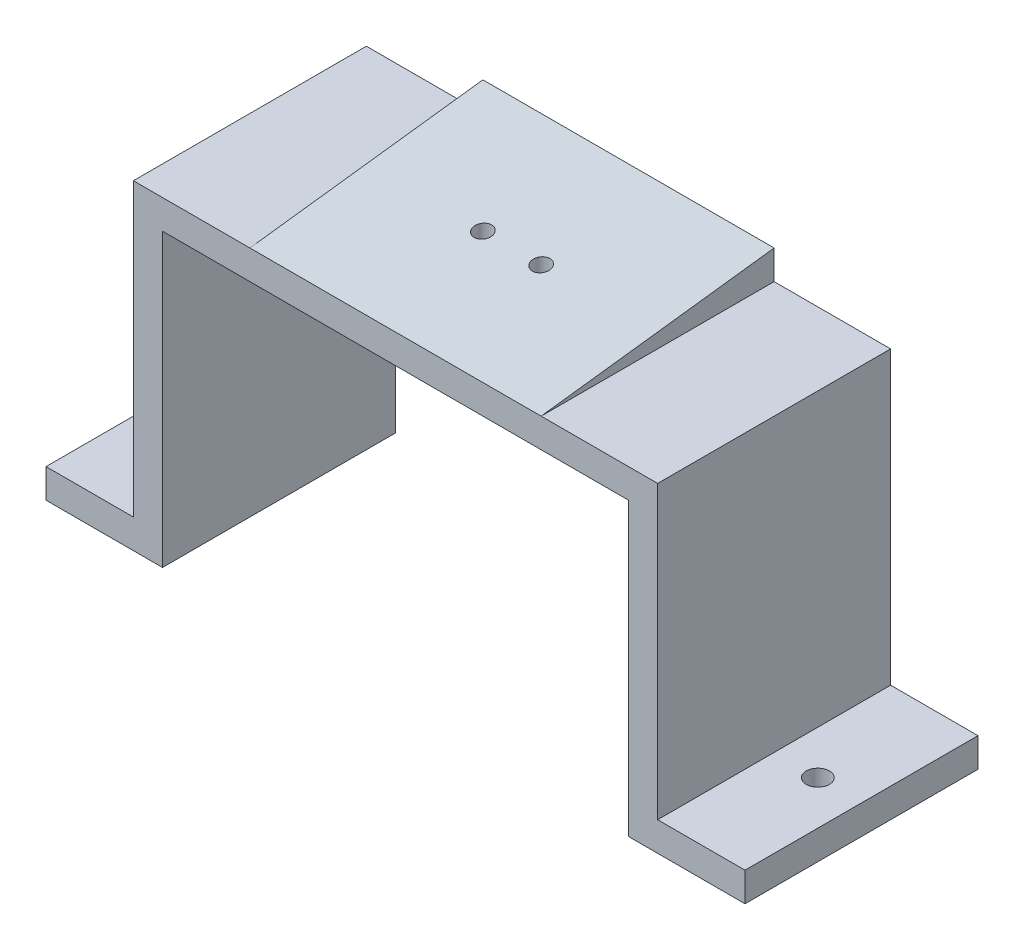
ISO-10303-21;
HEADER;
FILE_DESCRIPTION(('STEP AP214'),'2;1');
FILE_NAME('part.step','',(''),(''),'','','');
FILE_SCHEMA(('AUTOMOTIVE_DESIGN { 1 0 10303 214 1 1 1 1 }'));
ENDSEC;
DATA;
#1=APPLICATION_CONTEXT('core data for automotive mechanical design processes');
#2=APPLICATION_PROTOCOL_DEFINITION('international standard','automotive_design',2000,#1);
#3=PRODUCT_CONTEXT('',#1,'mechanical');
#4=PRODUCT('Part','Part','',(#3));
#5=PRODUCT_RELATED_PRODUCT_CATEGORY('part','',(#4));
#6=PRODUCT_DEFINITION_FORMATION('','',#4);
#7=PRODUCT_DEFINITION_CONTEXT('part definition',#1,'design');
#8=PRODUCT_DEFINITION('design','',#6,#7);
#9=PRODUCT_DEFINITION_SHAPE('','',#8);
#10=(LENGTH_UNIT() NAMED_UNIT(*) SI_UNIT(.MILLI.,.METRE.));
#11=(NAMED_UNIT(*) PLANE_ANGLE_UNIT() SI_UNIT($,.RADIAN.));
#12=(NAMED_UNIT(*) SI_UNIT($,.STERADIAN.) SOLID_ANGLE_UNIT());
#13=UNCERTAINTY_MEASURE_WITH_UNIT(LENGTH_MEASURE(1.E-05),#10,'distance_accuracy_value','');
#14=(GEOMETRIC_REPRESENTATION_CONTEXT(3) GLOBAL_UNCERTAINTY_ASSIGNED_CONTEXT((#13)) GLOBAL_UNIT_ASSIGNED_CONTEXT((#10,
#11,#12)) REPRESENTATION_CONTEXT('',''));
#15=CARTESIAN_POINT('',(0.,0.,0.));
#16=DIRECTION('',(0.,0.,1.));
#17=DIRECTION('',(1.,0.,0.));
#18=AXIS2_PLACEMENT_3D('',#15,#16,#17);
#19=CARTESIAN_POINT('',(-45.,0.,0.));
#20=DIRECTION('',(1.,0.,0.));
#21=DIRECTION('',(0.,0.,-1.));
#22=AXIS2_PLACEMENT_3D('',#19,#20,#21);
#23=PLANE('',#22);
#24=DIRECTION('',(0.,0.,-1.));
#25=VECTOR('',#24,1.);
#26=CARTESIAN_POINT('',(-45.,-45.,-19.9968025576209));
#27=LINE('',#26,#25);
#28=CARTESIAN_POINT('',(-45.,-45.,20.));
#29=VERTEX_POINT('',#28);
#30=CARTESIAN_POINT('',(-45.,-45.,-19.9968025576209));
#31=VERTEX_POINT('',#30);
#32=EDGE_CURVE('E241',#29,#31,#27,.T.);
#33=ORIENTED_EDGE('',*,*,#32,.F.);
#34=DIRECTION('',(0.,1.,0.));
#35=VECTOR('',#34,1.);
#36=CARTESIAN_POINT('',(-45.,5.,20.));
#37=LINE('',#36,#35);
#38=CARTESIAN_POINT('',(-45.,5.,20.));
#39=VERTEX_POINT('',#38);
#40=EDGE_CURVE('E274',#29,#39,#37,.T.);
#41=ORIENTED_EDGE('',*,*,#40,.T.);
#42=DIRECTION('',(0.,0.,-1.));
#43=VECTOR('',#42,1.);
#44=CARTESIAN_POINT('',(-45.,5.,20.));
#45=LINE('',#44,#43);
#46=CARTESIAN_POINT('',(-45.,5.,-19.9968025576209));
#47=VERTEX_POINT('',#46);
#48=EDGE_CURVE('E276',#39,#47,#45,.T.);
#49=ORIENTED_EDGE('',*,*,#48,.T.);
#50=DIRECTION('',(0.,-1.,0.));
#51=VECTOR('',#50,1.);
#52=CARTESIAN_POINT('',(-45.,5.,-19.9968025576209));
#53=LINE('',#52,#51);
#54=EDGE_CURVE('E279',#47,#31,#53,.T.);
#55=ORIENTED_EDGE('',*,*,#54,.T.);
#56=EDGE_LOOP('',(#33,#41,#49,#55));
#57=FACE_BOUND('',#56,.T.);
#58=ADVANCED_FACE('F33',(#57),#23,.F.);
#59=CARTESIAN_POINT('',(-45.,0.,20.));
#60=DIRECTION('',(0.,1.,0.));
#61=DIRECTION('',(0.,0.,1.));
#62=AXIS2_PLACEMENT_3D('',#59,#60,#61);
#63=PLANE('',#62);
#64=DIRECTION('',(0.,0.,1.));
#65=VECTOR('',#64,1.);
#66=CARTESIAN_POINT('',(-40.,0.,20.));
#67=LINE('',#66,#65);
#68=CARTESIAN_POINT('',(-40.,0.,-19.9968025576209));
#69=VERTEX_POINT('',#68);
#70=CARTESIAN_POINT('',(-40.,0.,20.));
#71=VERTEX_POINT('',#70);
#72=EDGE_CURVE('E260',#69,#71,#67,.T.);
#73=ORIENTED_EDGE('',*,*,#72,.F.);
#74=DIRECTION('',(1.,0.,0.));
#75=VECTOR('',#74,1.);
#76=CARTESIAN_POINT('',(-45.,0.,-19.9968025576209));
#77=LINE('',#76,#75);
#78=CARTESIAN_POINT('',(-25.,0.,-19.9968025576209));
#79=VERTEX_POINT('',#78);
#80=EDGE_CURVE('E291',#69,#79,#77,.T.);
#81=ORIENTED_EDGE('',*,*,#80,.T.);
#82=DIRECTION('',(0.,0.,1.));
#83=VECTOR('',#82,1.);
#84=CARTESIAN_POINT('',(-25.,0.,20.));
#85=LINE('',#84,#83);
#86=CARTESIAN_POINT('',(-25.,0.,20.));
#87=VERTEX_POINT('',#86);
#88=EDGE_CURVE('E277',#79,#87,#85,.T.);
#89=ORIENTED_EDGE('',*,*,#88,.T.);
#90=DIRECTION('',(1.,0.,0.));
#91=VECTOR('',#90,1.);
#92=CARTESIAN_POINT('',(-45.,0.,20.));
#93=LINE('',#92,#91);
#94=EDGE_CURVE('E281',#71,#87,#93,.T.);
#95=ORIENTED_EDGE('',*,*,#94,.F.);
#96=EDGE_LOOP('',(#73,#81,#89,#95));
#97=FACE_BOUND('',#96,.T.);
#98=ADVANCED_FACE('F350',(#97),#63,.F.);
#99=CARTESIAN_POINT('',(-25.,10.,-20.));
#100=DIRECTION('',(1.,0.,0.));
#101=DIRECTION('',(0.,0.,-1.));
#102=AXIS2_PLACEMENT_3D('',#99,#100,#101);
#103=PLANE('',#102);
#104=DIRECTION('',(0.,-1.,0.));
#105=VECTOR('',#104,1.);
#106=CARTESIAN_POINT('',(-25.,5.,-19.9968025576209));
#107=LINE('',#106,#105);
#108=CARTESIAN_POINT('',(-25.,5.,-19.9968025576209));
#109=VERTEX_POINT('',#108);
#110=CARTESIAN_POINT('',(-25.,4.99960031970261,-19.9968025576209));
#111=VERTEX_POINT('',#110);
#112=EDGE_CURVE('E285',#109,#111,#107,.T.);
#113=ORIENTED_EDGE('',*,*,#112,.F.);
#114=DIRECTION('',(0.,0.,-1.));
#115=VECTOR('',#114,1.);
#116=CARTESIAN_POINT('',(-25.,5.,20.));
#117=LINE('',#116,#115);
#118=CARTESIAN_POINT('',(-25.,5.,20.));
#119=VERTEX_POINT('',#118);
#120=EDGE_CURVE('E273',#119,#109,#117,.T.);
#121=ORIENTED_EDGE('',*,*,#120,.F.);
#122=DIRECTION('',(0.,-0.124034734589208,0.992277876713668));
#123=VECTOR('',#122,1.);
#124=CARTESIAN_POINT('',(-25.,10.,-20.));
#125=LINE('',#124,#123);
#126=CARTESIAN_POINT('',(-25.,10.,-20.));
#127=VERTEX_POINT('',#126);
#128=EDGE_CURVE('E310',#127,#119,#125,.T.);
#129=ORIENTED_EDGE('',*,*,#128,.F.);
#130=DIRECTION('',(0.,-1.,0.));
#131=VECTOR('',#130,1.);
#132=CARTESIAN_POINT('',(-25.,10.,-20.));
#133=LINE('',#132,#131);
#134=CARTESIAN_POINT('',(-25.,5.,-20.));
#135=VERTEX_POINT('',#134);
#136=EDGE_CURVE('E42',#127,#135,#133,.T.);
#137=ORIENTED_EDGE('',*,*,#136,.T.);
#138=DIRECTION('',(0.,0.124034734589208,-0.992277876713668));
#139=VECTOR('',#138,1.);
#140=CARTESIAN_POINT('',(-25.,0.,20.));
#141=LINE('',#140,#139);
#142=EDGE_CURVE('E299',#111,#135,#141,.T.);
#143=ORIENTED_EDGE('',*,*,#142,.F.);
#144=EDGE_LOOP('',(#113,#121,#129,#137,#143));
#145=FACE_BOUND('',#144,.T.);
#146=ADVANCED_FACE('F340',(#145),#103,.F.);
#147=CARTESIAN_POINT('',(-4.99999999999998,10.,0.));
#148=DIRECTION('',(0.,-1.,0.));
#149=DIRECTION('',(0.,0.,-1.));
#150=AXIS2_PLACEMENT_3D('',#147,#148,#149);
#151=CYLINDRICAL_SURFACE('',#150,1.5);
#152=CARTESIAN_POINT('',(-4.99999999999998,2.5,0.));
#153=DIRECTION('',(0.,0.992277876713668,0.124034734589208));
#154=DIRECTION('',(0.,-0.124034734589208,0.992277876713668));
#155=AXIS2_PLACEMENT_3D('',#152,#153,#154);
#156=ELLIPSE('',#155,1.51167332780598,1.5);
#157=CARTESIAN_POINT('',(-4.99999999999998,2.3125,1.5));
#158=VERTEX_POINT('',#157);
#159=EDGE_CURVE('E37',#158,#158,#156,.T.);
#160=ORIENTED_EDGE('',*,*,#159,.F.);
#161=EDGE_LOOP('',(#160));
#162=FACE_BOUND('',#161,.T.);
#163=CARTESIAN_POINT('',(-4.99999999999998,7.5,0.));
#164=DIRECTION('',(0.,-0.992277876713668,-0.124034734589208));
#165=DIRECTION('',(0.,-0.124034734589208,0.992277876713668));
#166=AXIS2_PLACEMENT_3D('',#163,#164,#165);
#167=ELLIPSE('',#166,1.51167332780598,1.5);
#168=CARTESIAN_POINT('',(-4.99999999999998,7.3125,1.5));
#169=VERTEX_POINT('',#168);
#170=EDGE_CURVE('E319',#169,#169,#167,.T.);
#171=ORIENTED_EDGE('',*,*,#170,.F.);
#172=EDGE_LOOP('',(#171));
#173=FACE_BOUND('',#172,.T.);
#174=ADVANCED_FACE('F338',(#162,#173),#151,.F.);
#175=CARTESIAN_POINT('',(25.,10.,-20.));
#176=DIRECTION('',(0.,-0.992277876713668,-0.124034734589208));
#177=DIRECTION('',(0.,0.124034734589208,-0.992277876713668));
#178=AXIS2_PLACEMENT_3D('',#175,#176,#177);
#179=PLANE('',#178);
#180=CARTESIAN_POINT('',(5.,7.5,0.));
#181=DIRECTION('',(0.,-0.992277876713668,-0.124034734589208));
#182=DIRECTION('',(0.,-0.124034734589208,0.992277876713668));
#183=AXIS2_PLACEMENT_3D('',#180,#181,#182);
#184=ELLIPSE('',#183,1.51167332780598,1.5);
#185=CARTESIAN_POINT('',(5.,7.3125,1.5));
#186=VERTEX_POINT('',#185);
#187=EDGE_CURVE('E320',#186,#186,#184,.T.);
#188=ORIENTED_EDGE('',*,*,#187,.T.);
#189=EDGE_LOOP('',(#188));
#190=FACE_BOUND('',#189,.T.);
#191=ORIENTED_EDGE('',*,*,#170,.T.);
#192=EDGE_LOOP('',(#191));
#193=FACE_BOUND('',#192,.T.);
#194=ORIENTED_EDGE('',*,*,#128,.T.);
#195=DIRECTION('',(-1.,0.,0.));
#196=VECTOR('',#195,1.);
#197=CARTESIAN_POINT('',(25.,5.,20.));
#198=LINE('',#197,#196);
#199=CARTESIAN_POINT('',(25.,5.,20.));
#200=VERTEX_POINT('',#199);
#201=EDGE_CURVE('E314',#200,#119,#198,.T.);
#202=ORIENTED_EDGE('',*,*,#201,.F.);
#203=DIRECTION('',(0.,-0.124034734589208,0.992277876713668));
#204=VECTOR('',#203,1.);
#205=CARTESIAN_POINT('',(25.,10.,-20.));
#206=LINE('',#205,#204);
#207=CARTESIAN_POINT('',(25.,10.,-20.));
#208=VERTEX_POINT('',#207);
#209=EDGE_CURVE('E311',#208,#200,#206,.T.);
#210=ORIENTED_EDGE('',*,*,#209,.F.);
#211=DIRECTION('',(-1.,0.,0.));
#212=VECTOR('',#211,1.);
#213=CARTESIAN_POINT('',(-25.,10.,-20.));
#214=LINE('',#213,#212);
#215=EDGE_CURVE('E327',#208,#127,#214,.T.);
#216=ORIENTED_EDGE('',*,*,#215,.T.);
#217=EDGE_LOOP('',(#194,#202,#210,#216));
#218=FACE_BOUND('',#217,.T.);
#219=ADVANCED_FACE('F335',(#190,#193,#218),#179,.F.);
#220=CARTESIAN_POINT('',(25.,0.,20.));
#221=DIRECTION('',(0.,0.992277876713668,0.124034734589208));
#222=DIRECTION('',(0.,-0.124034734589208,0.992277876713668));
#223=AXIS2_PLACEMENT_3D('',#220,#221,#222);
#224=PLANE('',#223);
#225=CARTESIAN_POINT('',(5.,2.5,0.));
#226=DIRECTION('',(0.,0.992277876713668,0.124034734589208));
#227=DIRECTION('',(0.,-0.124034734589208,0.992277876713668));
#228=AXIS2_PLACEMENT_3D('',#225,#226,#227);
#229=ELLIPSE('',#228,1.51167332780598,1.5);
#230=CARTESIAN_POINT('',(5.,2.3125,1.5));
#231=VERTEX_POINT('',#230);
#232=EDGE_CURVE('E323',#231,#231,#229,.T.);
#233=ORIENTED_EDGE('',*,*,#232,.T.);
#234=EDGE_LOOP('',(#233));
#235=FACE_BOUND('',#234,.T.);
#236=ORIENTED_EDGE('',*,*,#159,.T.);
#237=EDGE_LOOP('',(#236));
#238=FACE_BOUND('',#237,.T.);
#239=EDGE_CURVE('E305',#87,#111,#141,.T.);
#240=ORIENTED_EDGE('',*,*,#239,.T.);
#241=ORIENTED_EDGE('',*,*,#142,.T.);
#242=DIRECTION('',(-1.,0.,0.));
#243=VECTOR('',#242,1.);
#244=CARTESIAN_POINT('',(25.,5.,-20.));
#245=LINE('',#244,#243);
#246=CARTESIAN_POINT('',(25.,5.,-20.));
#247=VERTEX_POINT('',#246);
#248=EDGE_CURVE('E303',#247,#135,#245,.T.);
#249=ORIENTED_EDGE('',*,*,#248,.F.);
#250=DIRECTION('',(0.,0.124034734589208,-0.992277876713668));
#251=VECTOR('',#250,1.);
#252=CARTESIAN_POINT('',(25.,0.,20.));
#253=LINE('',#252,#251);
#254=CARTESIAN_POINT('',(25.,4.99960031970262,-19.9968025576209));
#255=VERTEX_POINT('',#254);
#256=EDGE_CURVE('E304',#255,#247,#253,.T.);
#257=ORIENTED_EDGE('',*,*,#256,.F.);
#258=CARTESIAN_POINT('',(25.,0.,20.));
#259=VERTEX_POINT('',#258);
#260=EDGE_CURVE('E300',#259,#255,#253,.T.);
#261=ORIENTED_EDGE('',*,*,#260,.F.);
#262=DIRECTION('',(1.,0.,0.));
#263=VECTOR('',#262,1.);
#264=CARTESIAN_POINT('',(-25.,0.,20.));
#265=LINE('',#264,#263);
#266=EDGE_CURVE('E326',#87,#259,#265,.T.);
#267=ORIENTED_EDGE('',*,*,#266,.F.);
#268=EDGE_LOOP('',(#240,#241,#249,#257,#261,#267));
#269=FACE_BOUND('',#268,.T.);
#270=ADVANCED_FACE('F347',(#235,#238,#269),#224,.F.);
#271=CARTESIAN_POINT('',(5.,10.,0.));
#272=DIRECTION('',(0.,-1.,0.));
#273=DIRECTION('',(0.,0.,-1.));
#274=AXIS2_PLACEMENT_3D('',#271,#272,#273);
#275=CYLINDRICAL_SURFACE('',#274,1.5);
#276=ORIENTED_EDGE('',*,*,#232,.F.);
#277=EDGE_LOOP('',(#276));
#278=FACE_BOUND('',#277,.T.);
#279=ORIENTED_EDGE('',*,*,#187,.F.);
#280=EDGE_LOOP('',(#279));
#281=FACE_BOUND('',#280,.T.);
#282=ADVANCED_FACE('F381',(#278,#281),#275,.F.);
#283=CARTESIAN_POINT('',(25.,10.,-20.));
#284=DIRECTION('',(-1.,0.,0.));
#285=DIRECTION('',(0.,0.,1.));
#286=AXIS2_PLACEMENT_3D('',#283,#284,#285);
#287=PLANE('',#286);
#288=ORIENTED_EDGE('',*,*,#209,.T.);
#289=DIRECTION('',(0.,0.,-1.));
#290=VECTOR('',#289,1.);
#291=CARTESIAN_POINT('',(25.,5.,20.));
#292=LINE('',#291,#290);
#293=CARTESIAN_POINT('',(25.,5.,-19.9968025576209));
#294=VERTEX_POINT('',#293);
#295=EDGE_CURVE('E214',#200,#294,#292,.T.);
#296=ORIENTED_EDGE('',*,*,#295,.T.);
#297=DIRECTION('',(0.,-1.,0.));
#298=VECTOR('',#297,1.);
#299=CARTESIAN_POINT('',(25.,5.,-19.9968025576209));
#300=LINE('',#299,#298);
#301=EDGE_CURVE('E223',#294,#255,#300,.T.);
#302=ORIENTED_EDGE('',*,*,#301,.T.);
#303=ORIENTED_EDGE('',*,*,#256,.T.);
#304=DIRECTION('',(0.,-1.,0.));
#305=VECTOR('',#304,1.);
#306=CARTESIAN_POINT('',(25.,10.,-20.));
#307=LINE('',#306,#305);
#308=EDGE_CURVE('E11',#208,#247,#307,.T.);
#309=ORIENTED_EDGE('',*,*,#308,.F.);
#310=EDGE_LOOP('',(#288,#296,#302,#303,#309));
#311=FACE_BOUND('',#310,.T.);
#312=ADVANCED_FACE('F35',(#311),#287,.F.);
#313=CARTESIAN_POINT('',(-25.,10.,-20.));
#314=DIRECTION('',(0.,0.,1.));
#315=DIRECTION('',(1.,0.,0.));
#316=AXIS2_PLACEMENT_3D('',#313,#314,#315);
#317=PLANE('',#316);
#318=ORIENTED_EDGE('',*,*,#308,.T.);
#319=ORIENTED_EDGE('',*,*,#248,.T.);
#320=ORIENTED_EDGE('',*,*,#136,.F.);
#321=ORIENTED_EDGE('',*,*,#215,.F.);
#322=EDGE_LOOP('',(#318,#319,#320,#321));
#323=FACE_BOUND('',#322,.T.);
#324=ADVANCED_FACE('F415',(#323),#317,.F.);
#325=CARTESIAN_POINT('',(-25.,10.,20.));
#326=DIRECTION('',(0.,0.,-1.));
#327=DIRECTION('',(-1.,0.,0.));
#328=AXIS2_PLACEMENT_3D('',#325,#326,#327);
#329=PLANE('',#328);
#330=ORIENTED_EDGE('',*,*,#266,.T.);
#331=DIRECTION('',(-1.,0.,0.));
#332=VECTOR('',#331,1.);
#333=CARTESIAN_POINT('',(45.,0.,20.));
#334=LINE('',#333,#332);
#335=CARTESIAN_POINT('',(40.,0.,20.));
#336=VERTEX_POINT('',#335);
#337=EDGE_CURVE('E233',#336,#259,#334,.T.);
#338=ORIENTED_EDGE('',*,*,#337,.F.);
#339=DIRECTION('',(0.,1.,0.));
#340=VECTOR('',#339,1.);
#341=CARTESIAN_POINT('',(40.,-50.,20.));
#342=LINE('',#341,#340);
#343=CARTESIAN_POINT('',(40.,-50.,20.));
#344=VERTEX_POINT('',#343);
#345=EDGE_CURVE('E208',#344,#336,#342,.T.);
#346=ORIENTED_EDGE('',*,*,#345,.F.);
#347=DIRECTION('',(1.,0.,0.));
#348=VECTOR('',#347,1.);
#349=CARTESIAN_POINT('',(45.,-50.,20.));
#350=LINE('',#349,#348);
#351=CARTESIAN_POINT('',(60.,-50.,20.));
#352=VERTEX_POINT('',#351);
#353=EDGE_CURVE('E197',#344,#352,#350,.T.);
#354=ORIENTED_EDGE('',*,*,#353,.T.);
#355=DIRECTION('',(0.,1.,0.));
#356=VECTOR('',#355,1.);
#357=CARTESIAN_POINT('',(60.,-50.,20.));
#358=LINE('',#357,#356);
#359=CARTESIAN_POINT('',(60.,-45.,20.));
#360=VERTEX_POINT('',#359);
#361=EDGE_CURVE('E188',#352,#360,#358,.T.);
#362=ORIENTED_EDGE('',*,*,#361,.T.);
#363=DIRECTION('',(-1.,0.,0.));
#364=VECTOR('',#363,1.);
#365=CARTESIAN_POINT('',(60.,-45.,20.));
#366=LINE('',#365,#364);
#367=CARTESIAN_POINT('',(45.,-45.,20.));
#368=VERTEX_POINT('',#367);
#369=EDGE_CURVE('E175',#360,#368,#366,.T.);
#370=ORIENTED_EDGE('',*,*,#369,.T.);
#371=DIRECTION('',(0.,1.,0.));
#372=VECTOR('',#371,1.);
#373=CARTESIAN_POINT('',(45.,5.,20.));
#374=LINE('',#373,#372);
#375=CARTESIAN_POINT('',(45.,5.,20.));
#376=VERTEX_POINT('',#375);
#377=EDGE_CURVE('E212',#368,#376,#374,.T.);
#378=ORIENTED_EDGE('',*,*,#377,.T.);
#379=DIRECTION('',(-1.,0.,0.));
#380=VECTOR('',#379,1.);
#381=CARTESIAN_POINT('',(45.,5.,20.));
#382=LINE('',#381,#380);
#383=EDGE_CURVE('E219',#376,#200,#382,.T.);
#384=ORIENTED_EDGE('',*,*,#383,.T.);
#385=ORIENTED_EDGE('',*,*,#201,.T.);
#386=DIRECTION('',(1.,0.,0.));
#387=VECTOR('',#386,1.);
#388=CARTESIAN_POINT('',(-45.,5.,20.));
#389=LINE('',#388,#387);
#390=EDGE_CURVE('E296',#39,#119,#389,.T.);
#391=ORIENTED_EDGE('',*,*,#390,.F.);
#392=ORIENTED_EDGE('',*,*,#40,.F.);
#393=DIRECTION('',(1.,0.,0.));
#394=VECTOR('',#393,1.);
#395=CARTESIAN_POINT('',(-60.,-45.,20.));
#396=LINE('',#395,#394);
#397=CARTESIAN_POINT('',(-60.,-45.,20.));
#398=VERTEX_POINT('',#397);
#399=EDGE_CURVE('E257',#398,#29,#396,.T.);
#400=ORIENTED_EDGE('',*,*,#399,.F.);
#401=DIRECTION('',(0.,1.,0.));
#402=VECTOR('',#401,1.);
#403=CARTESIAN_POINT('',(-60.,-50.,20.));
#404=LINE('',#403,#402);
#405=CARTESIAN_POINT('',(-60.,-50.,20.));
#406=VERTEX_POINT('',#405);
#407=EDGE_CURVE('E248',#406,#398,#404,.T.);
#408=ORIENTED_EDGE('',*,*,#407,.F.);
#409=DIRECTION('',(-1.,0.,0.));
#410=VECTOR('',#409,1.);
#411=CARTESIAN_POINT('',(-45.,-50.,20.));
#412=LINE('',#411,#410);
#413=CARTESIAN_POINT('',(-40.,-50.,20.));
#414=VERTEX_POINT('',#413);
#415=EDGE_CURVE('E265',#414,#406,#412,.T.);
#416=ORIENTED_EDGE('',*,*,#415,.F.);
#417=DIRECTION('',(0.,1.,0.));
#418=VECTOR('',#417,1.);
#419=CARTESIAN_POINT('',(-40.,-50.,20.));
#420=LINE('',#419,#418);
#421=EDGE_CURVE('E267',#414,#71,#420,.T.);
#422=ORIENTED_EDGE('',*,*,#421,.T.);
#423=ORIENTED_EDGE('',*,*,#94,.T.);
#424=EDGE_LOOP('',(#330,#338,#346,#354,#362,#370,#378,#384,#385,#391,#392,#400,#408,#416,#422,#423));
#425=FACE_BOUND('',#424,.T.);
#426=ADVANCED_FACE('F370',(#425),#329,.F.);
#427=CARTESIAN_POINT('',(-25.,0.,0.));
#428=DIRECTION('',(1.,0.,0.));
#429=DIRECTION('',(0.,0.,-1.));
#430=AXIS2_PLACEMENT_3D('',#427,#428,#429);
#431=PLANE('',#430);
#432=ORIENTED_EDGE('',*,*,#239,.F.);
#433=ORIENTED_EDGE('',*,*,#88,.F.);
#434=EDGE_CURVE('E284',#111,#79,#107,.T.);
#435=ORIENTED_EDGE('',*,*,#434,.F.);
#436=EDGE_LOOP('',(#432,#433,#435));
#437=FACE_BOUND('',#436,.T.);
#438=ADVANCED_FACE('F367',(#437),#431,.T.);
#439=CARTESIAN_POINT('',(-45.,5.,20.));
#440=DIRECTION('',(0.,-1.,0.));
#441=DIRECTION('',(0.,0.,-1.));
#442=AXIS2_PLACEMENT_3D('',#439,#440,#441);
#443=PLANE('',#442);
#444=ORIENTED_EDGE('',*,*,#120,.T.);
#445=DIRECTION('',(1.,0.,0.));
#446=VECTOR('',#445,1.);
#447=CARTESIAN_POINT('',(-45.,5.,-19.9968025576209));
#448=LINE('',#447,#446);
#449=EDGE_CURVE('E293',#47,#109,#448,.T.);
#450=ORIENTED_EDGE('',*,*,#449,.F.);
#451=ORIENTED_EDGE('',*,*,#48,.F.);
#452=ORIENTED_EDGE('',*,*,#390,.T.);
#453=EDGE_LOOP('',(#444,#450,#451,#452));
#454=FACE_BOUND('',#453,.T.);
#455=ADVANCED_FACE('F369',(#454),#443,.F.);
#456=CARTESIAN_POINT('',(-45.,5.,-19.9968025576209));
#457=DIRECTION('',(0.,0.,1.));
#458=DIRECTION('',(1.,0.,0.));
#459=AXIS2_PLACEMENT_3D('',#456,#457,#458);
#460=PLANE('',#459);
#461=ORIENTED_EDGE('',*,*,#112,.T.);
#462=ORIENTED_EDGE('',*,*,#434,.T.);
#463=ORIENTED_EDGE('',*,*,#80,.F.);
#464=DIRECTION('',(0.,1.,0.));
#465=VECTOR('',#464,1.);
#466=CARTESIAN_POINT('',(-40.,-50.,-19.9968025576209));
#467=LINE('',#466,#465);
#468=CARTESIAN_POINT('',(-40.,-50.,-19.9968025576209));
#469=VERTEX_POINT('',#468);
#470=EDGE_CURVE('E271',#469,#69,#467,.T.);
#471=ORIENTED_EDGE('',*,*,#470,.F.);
#472=DIRECTION('',(1.,0.,0.));
#473=VECTOR('',#472,1.);
#474=CARTESIAN_POINT('',(-45.,-50.,-19.9968025576209));
#475=LINE('',#474,#473);
#476=CARTESIAN_POINT('',(-60.,-50.,-19.9968025576209));
#477=VERTEX_POINT('',#476);
#478=EDGE_CURVE('E261',#477,#469,#475,.T.);
#479=ORIENTED_EDGE('',*,*,#478,.F.);
#480=DIRECTION('',(0.,-1.,0.));
#481=VECTOR('',#480,1.);
#482=CARTESIAN_POINT('',(-60.,-50.,-19.9968025576209));
#483=LINE('',#482,#481);
#484=CARTESIAN_POINT('',(-60.,-45.,-19.9968025576209));
#485=VERTEX_POINT('',#484);
#486=EDGE_CURVE('E242',#485,#477,#483,.T.);
#487=ORIENTED_EDGE('',*,*,#486,.F.);
#488=DIRECTION('',(1.,0.,0.));
#489=VECTOR('',#488,1.);
#490=CARTESIAN_POINT('',(-60.,-45.,-19.9968025576209));
#491=LINE('',#490,#489);
#492=EDGE_CURVE('E252',#485,#31,#491,.T.);
#493=ORIENTED_EDGE('',*,*,#492,.T.);
#494=ORIENTED_EDGE('',*,*,#54,.F.);
#495=ORIENTED_EDGE('',*,*,#449,.T.);
#496=EDGE_LOOP('',(#461,#462,#463,#471,#479,#487,#493,#494,#495));
#497=FACE_BOUND('',#496,.T.);
#498=ADVANCED_FACE('F373',(#497),#460,.F.);
#499=CARTESIAN_POINT('',(-40.,-50.,20.));
#500=DIRECTION('',(-1.,0.,0.));
#501=DIRECTION('',(0.,0.,1.));
#502=AXIS2_PLACEMENT_3D('',#499,#500,#501);
#503=PLANE('',#502);
#504=ORIENTED_EDGE('',*,*,#72,.T.);
#505=ORIENTED_EDGE('',*,*,#421,.F.);
#506=DIRECTION('',(0.,0.,1.));
#507=VECTOR('',#506,1.);
#508=CARTESIAN_POINT('',(-40.,-50.,20.));
#509=LINE('',#508,#507);
#510=EDGE_CURVE('E263',#469,#414,#509,.T.);
#511=ORIENTED_EDGE('',*,*,#510,.F.);
#512=ORIENTED_EDGE('',*,*,#470,.T.);
#513=EDGE_LOOP('',(#504,#505,#511,#512));
#514=FACE_BOUND('',#513,.T.);
#515=ADVANCED_FACE('F365',(#514),#503,.F.);
#516=CARTESIAN_POINT('',(0.,-50.,0.));
#517=DIRECTION('',(0.,-1.,0.));
#518=DIRECTION('',(0.,0.,-1.));
#519=AXIS2_PLACEMENT_3D('',#516,#517,#518);
#520=PLANE('',#519);
#521=CARTESIAN_POINT('',(-52.5,-50.,0.00159872118953713));
#522=DIRECTION('',(0.,-1.,0.));
#523=DIRECTION('',(0.,0.,-1.));
#524=AXIS2_PLACEMENT_3D('',#521,#522,#523);
#525=CIRCLE('',#524,2.);
#526=CARTESIAN_POINT('',(-52.5,-50.,-1.99840127881047));
#527=VERTEX_POINT('',#526);
#528=EDGE_CURVE('E238',#527,#527,#525,.F.);
#529=ORIENTED_EDGE('',*,*,#528,.T.);
#530=EDGE_LOOP('',(#529));
#531=FACE_BOUND('',#530,.T.);
#532=ORIENTED_EDGE('',*,*,#415,.T.);
#533=DIRECTION('',(0.,0.,1.));
#534=VECTOR('',#533,1.);
#535=CARTESIAN_POINT('',(-60.,-50.,-19.9968025576209));
#536=LINE('',#535,#534);
#537=EDGE_CURVE('E245',#477,#406,#536,.T.);
#538=ORIENTED_EDGE('',*,*,#537,.F.);
#539=ORIENTED_EDGE('',*,*,#478,.T.);
#540=ORIENTED_EDGE('',*,*,#510,.T.);
#541=EDGE_LOOP('',(#532,#538,#539,#540));
#542=FACE_BOUND('',#541,.T.);
#543=ADVANCED_FACE('F429',(#531,#542),#520,.T.);
#544=CARTESIAN_POINT('',(-60.,-45.,-19.9968025576209));
#545=DIRECTION('',(0.,-1.,0.));
#546=DIRECTION('',(0.,0.,-1.));
#547=AXIS2_PLACEMENT_3D('',#544,#545,#546);
#548=PLANE('',#547);
#549=CARTESIAN_POINT('',(-52.5,-45.,0.00159872118953713));
#550=DIRECTION('',(0.,1.,0.));
#551=DIRECTION('',(0.,0.,1.));
#552=AXIS2_PLACEMENT_3D('',#549,#550,#551);
#553=CIRCLE('',#552,2.);
#554=CARTESIAN_POINT('',(-52.5,-45.,2.00159872118954));
#555=VERTEX_POINT('',#554);
#556=EDGE_CURVE('E235',#555,#555,#553,.T.);
#557=ORIENTED_EDGE('',*,*,#556,.F.);
#558=EDGE_LOOP('',(#557));
#559=FACE_BOUND('',#558,.T.);
#560=ORIENTED_EDGE('',*,*,#32,.T.);
#561=ORIENTED_EDGE('',*,*,#492,.F.);
#562=DIRECTION('',(0.,0.,-1.));
#563=VECTOR('',#562,1.);
#564=CARTESIAN_POINT('',(-60.,-45.,-19.9968025576209));
#565=LINE('',#564,#563);
#566=EDGE_CURVE('E250',#398,#485,#565,.T.);
#567=ORIENTED_EDGE('',*,*,#566,.F.);
#568=ORIENTED_EDGE('',*,*,#399,.T.);
#569=EDGE_LOOP('',(#560,#561,#567,#568));
#570=FACE_BOUND('',#569,.T.);
#571=ADVANCED_FACE('F436',(#559,#570),#548,.F.);
#572=CARTESIAN_POINT('',(-60.,0.,0.));
#573=DIRECTION('',(1.,0.,0.));
#574=DIRECTION('',(0.,0.,-1.));
#575=AXIS2_PLACEMENT_3D('',#572,#573,#574);
#576=PLANE('',#575);
#577=ORIENTED_EDGE('',*,*,#486,.T.);
#578=ORIENTED_EDGE('',*,*,#537,.T.);
#579=ORIENTED_EDGE('',*,*,#407,.T.);
#580=ORIENTED_EDGE('',*,*,#566,.T.);
#581=EDGE_LOOP('',(#577,#578,#579,#580));
#582=FACE_BOUND('',#581,.T.);
#583=ADVANCED_FACE('F432',(#582),#576,.F.);
#584=CARTESIAN_POINT('',(-52.5,-55.6568542494924,0.00159872118953713));
#585=DIRECTION('',(0.,1.,0.));
#586=DIRECTION('',(0.,0.,1.));
#587=AXIS2_PLACEMENT_3D('',#584,#585,#586);
#588=CYLINDRICAL_SURFACE('',#587,2.);
#589=ORIENTED_EDGE('',*,*,#556,.T.);
#590=EDGE_LOOP('',(#589));
#591=FACE_BOUND('',#590,.T.);
#592=ORIENTED_EDGE('',*,*,#528,.F.);
#593=EDGE_LOOP('',(#592));
#594=FACE_BOUND('',#593,.T.);
#595=ADVANCED_FACE('F444',(#591,#594),#588,.F.);
#596=CARTESIAN_POINT('',(45.,0.,20.));
#597=DIRECTION('',(0.,-1.,0.));
#598=DIRECTION('',(0.,0.,-1.));
#599=AXIS2_PLACEMENT_3D('',#596,#597,#598);
#600=PLANE('',#599);
#601=DIRECTION('',(0.,0.,1.));
#602=VECTOR('',#601,1.);
#603=CARTESIAN_POINT('',(40.,0.,20.));
#604=LINE('',#603,#602);
#605=CARTESIAN_POINT('',(40.,0.,-19.9968025576209));
#606=VERTEX_POINT('',#605);
#607=EDGE_CURVE('E58',#606,#336,#604,.T.);
#608=ORIENTED_EDGE('',*,*,#607,.T.);
#609=ORIENTED_EDGE('',*,*,#337,.T.);
#610=DIRECTION('',(0.,0.,1.));
#611=VECTOR('',#610,1.);
#612=CARTESIAN_POINT('',(25.,0.,20.));
#613=LINE('',#612,#611);
#614=CARTESIAN_POINT('',(25.,0.,-19.9968025576209));
#615=VERTEX_POINT('',#614);
#616=EDGE_CURVE('E211',#615,#259,#613,.T.);
#617=ORIENTED_EDGE('',*,*,#616,.F.);
#618=DIRECTION('',(-1.,0.,0.));
#619=VECTOR('',#618,1.);
#620=CARTESIAN_POINT('',(45.,0.,-19.9968025576209));
#621=LINE('',#620,#619);
#622=EDGE_CURVE('E231',#606,#615,#621,.T.);
#623=ORIENTED_EDGE('',*,*,#622,.F.);
#624=EDGE_LOOP('',(#608,#609,#617,#623));
#625=FACE_BOUND('',#624,.T.);
#626=ADVANCED_FACE('F451',(#625),#600,.T.);
#627=CARTESIAN_POINT('',(45.,5.,-19.9968025576209));
#628=DIRECTION('',(0.,0.,-1.));
#629=DIRECTION('',(-1.,0.,0.));
#630=AXIS2_PLACEMENT_3D('',#627,#628,#629);
#631=PLANE('',#630);
#632=ORIENTED_EDGE('',*,*,#301,.F.);
#633=DIRECTION('',(-1.,0.,0.));
#634=VECTOR('',#633,1.);
#635=CARTESIAN_POINT('',(45.,5.,-19.9968025576209));
#636=LINE('',#635,#634);
#637=CARTESIAN_POINT('',(45.,5.,-19.9968025576209));
#638=VERTEX_POINT('',#637);
#639=EDGE_CURVE('E229',#638,#294,#636,.T.);
#640=ORIENTED_EDGE('',*,*,#639,.F.);
#641=DIRECTION('',(0.,-1.,0.));
#642=VECTOR('',#641,1.);
#643=CARTESIAN_POINT('',(45.,5.,-19.9968025576209));
#644=LINE('',#643,#642);
#645=CARTESIAN_POINT('',(45.,-45.,-19.9968025576209));
#646=VERTEX_POINT('',#645);
#647=EDGE_CURVE('E174',#638,#646,#644,.T.);
#648=ORIENTED_EDGE('',*,*,#647,.T.);
#649=DIRECTION('',(-1.,0.,0.));
#650=VECTOR('',#649,1.);
#651=CARTESIAN_POINT('',(60.,-45.,-19.9968025576209));
#652=LINE('',#651,#650);
#653=CARTESIAN_POINT('',(60.,-45.,-19.9968025576209));
#654=VERTEX_POINT('',#653);
#655=EDGE_CURVE('E50',#654,#646,#652,.T.);
#656=ORIENTED_EDGE('',*,*,#655,.F.);
#657=DIRECTION('',(0.,-1.,0.));
#658=VECTOR('',#657,1.);
#659=CARTESIAN_POINT('',(60.,-50.,-19.9968025576209));
#660=LINE('',#659,#658);
#661=CARTESIAN_POINT('',(60.,-50.,-19.9968025576209));
#662=VERTEX_POINT('',#661);
#663=EDGE_CURVE('E171',#654,#662,#660,.T.);
#664=ORIENTED_EDGE('',*,*,#663,.T.);
#665=DIRECTION('',(-1.,0.,0.));
#666=VECTOR('',#665,1.);
#667=CARTESIAN_POINT('',(45.,-50.,-19.9968025576209));
#668=LINE('',#667,#666);
#669=CARTESIAN_POINT('',(40.,-50.,-19.9968025576209));
#670=VERTEX_POINT('',#669);
#671=EDGE_CURVE('E202',#662,#670,#668,.T.);
#672=ORIENTED_EDGE('',*,*,#671,.T.);
#673=DIRECTION('',(0.,1.,0.));
#674=VECTOR('',#673,1.);
#675=CARTESIAN_POINT('',(40.,-50.,-19.9968025576209));
#676=LINE('',#675,#674);
#677=EDGE_CURVE('E204',#670,#606,#676,.T.);
#678=ORIENTED_EDGE('',*,*,#677,.T.);
#679=ORIENTED_EDGE('',*,*,#622,.T.);
#680=EDGE_CURVE('E222',#255,#615,#300,.T.);
#681=ORIENTED_EDGE('',*,*,#680,.F.);
#682=EDGE_LOOP('',(#632,#640,#648,#656,#664,#672,#678,#679,#681));
#683=FACE_BOUND('',#682,.T.);
#684=ADVANCED_FACE('F169',(#683),#631,.T.);
#685=CARTESIAN_POINT('',(45.,5.,20.));
#686=DIRECTION('',(0.,1.,0.));
#687=DIRECTION('',(0.,0.,1.));
#688=AXIS2_PLACEMENT_3D('',#685,#686,#687);
#689=PLANE('',#688);
#690=ORIENTED_EDGE('',*,*,#295,.F.);
#691=ORIENTED_EDGE('',*,*,#383,.F.);
#692=DIRECTION('',(0.,0.,-1.));
#693=VECTOR('',#692,1.);
#694=CARTESIAN_POINT('',(45.,5.,20.));
#695=LINE('',#694,#693);
#696=EDGE_CURVE('E216',#376,#638,#695,.T.);
#697=ORIENTED_EDGE('',*,*,#696,.T.);
#698=ORIENTED_EDGE('',*,*,#639,.T.);
#699=EDGE_LOOP('',(#690,#691,#697,#698));
#700=FACE_BOUND('',#699,.T.);
#701=ADVANCED_FACE('F457',(#700),#689,.T.);
#702=CARTESIAN_POINT('',(45.,0.,0.));
#703=DIRECTION('',(-1.,0.,0.));
#704=DIRECTION('',(0.,0.,-1.));
#705=AXIS2_PLACEMENT_3D('',#702,#703,#704);
#706=PLANE('',#705);
#707=ORIENTED_EDGE('',*,*,#377,.F.);
#708=DIRECTION('',(0.,0.,-1.));
#709=VECTOR('',#708,1.);
#710=CARTESIAN_POINT('',(45.,-45.,-19.9968025576209));
#711=LINE('',#710,#709);
#712=EDGE_CURVE('E185',#368,#646,#711,.T.);
#713=ORIENTED_EDGE('',*,*,#712,.T.);
#714=ORIENTED_EDGE('',*,*,#647,.F.);
#715=ORIENTED_EDGE('',*,*,#696,.F.);
#716=EDGE_LOOP('',(#707,#713,#714,#715));
#717=FACE_BOUND('',#716,.T.);
#718=ADVANCED_FACE('F460',(#717),#706,.F.);
#719=CARTESIAN_POINT('',(25.,0.,0.));
#720=DIRECTION('',(-1.,0.,0.));
#721=DIRECTION('',(0.,0.,-1.));
#722=AXIS2_PLACEMENT_3D('',#719,#720,#721);
#723=PLANE('',#722);
#724=ORIENTED_EDGE('',*,*,#616,.T.);
#725=ORIENTED_EDGE('',*,*,#260,.T.);
#726=ORIENTED_EDGE('',*,*,#680,.T.);
#727=EDGE_LOOP('',(#724,#725,#726));
#728=FACE_BOUND('',#727,.T.);
#729=ADVANCED_FACE('F462',(#728),#723,.T.);
#730=CARTESIAN_POINT('',(40.,-50.,20.));
#731=DIRECTION('',(-1.,0.,0.));
#732=DIRECTION('',(0.,0.,1.));
#733=AXIS2_PLACEMENT_3D('',#730,#731,#732);
#734=PLANE('',#733);
#735=ORIENTED_EDGE('',*,*,#607,.F.);
#736=ORIENTED_EDGE('',*,*,#677,.F.);
#737=DIRECTION('',(0.,0.,1.));
#738=VECTOR('',#737,1.);
#739=CARTESIAN_POINT('',(40.,-50.,20.));
#740=LINE('',#739,#738);
#741=EDGE_CURVE('E199',#670,#344,#740,.T.);
#742=ORIENTED_EDGE('',*,*,#741,.T.);
#743=ORIENTED_EDGE('',*,*,#345,.T.);
#744=EDGE_LOOP('',(#735,#736,#742,#743));
#745=FACE_BOUND('',#744,.T.);
#746=ADVANCED_FACE('F465',(#745),#734,.T.);
#747=CARTESIAN_POINT('',(0.,-50.,0.));
#748=DIRECTION('',(0.,-1.,0.));
#749=DIRECTION('',(0.,0.,-1.));
#750=AXIS2_PLACEMENT_3D('',#747,#748,#749);
#751=PLANE('',#750);
#752=CARTESIAN_POINT('',(52.5,-50.,0.00159872118951892));
#753=DIRECTION('',(0.,-1.,0.));
#754=DIRECTION('',(0.,0.,-1.));
#755=AXIS2_PLACEMENT_3D('',#752,#753,#754);
#756=CIRCLE('',#755,2.);
#757=CARTESIAN_POINT('',(52.5,-50.,-1.99840127881048));
#758=VERTEX_POINT('',#757);
#759=EDGE_CURVE('E195',#758,#758,#756,.T.);
#760=ORIENTED_EDGE('',*,*,#759,.F.);
#761=EDGE_LOOP('',(#760));
#762=FACE_BOUND('',#761,.T.);
#763=ORIENTED_EDGE('',*,*,#671,.F.);
#764=DIRECTION('',(0.,0.,1.));
#765=VECTOR('',#764,1.);
#766=CARTESIAN_POINT('',(60.,-50.,-19.9968025576209));
#767=LINE('',#766,#765);
#768=EDGE_CURVE('E184',#662,#352,#767,.T.);
#769=ORIENTED_EDGE('',*,*,#768,.T.);
#770=ORIENTED_EDGE('',*,*,#353,.F.);
#771=ORIENTED_EDGE('',*,*,#741,.F.);
#772=EDGE_LOOP('',(#763,#769,#770,#771));
#773=FACE_BOUND('',#772,.T.);
#774=ADVANCED_FACE('F471',(#762,#773),#751,.T.);
#775=CARTESIAN_POINT('',(60.,-45.,-19.9968025576209));
#776=DIRECTION('',(0.,1.,0.));
#777=DIRECTION('',(0.,0.,1.));
#778=AXIS2_PLACEMENT_3D('',#775,#776,#777);
#779=PLANE('',#778);
#780=CARTESIAN_POINT('',(52.5,-45.,0.00159872118951892));
#781=DIRECTION('',(0.,-1.,0.));
#782=DIRECTION('',(0.,0.,1.));
#783=AXIS2_PLACEMENT_3D('',#780,#781,#782);
#784=CIRCLE('',#783,2.);
#785=CARTESIAN_POINT('',(52.5,-45.,2.00159872118952));
#786=VERTEX_POINT('',#785);
#787=EDGE_CURVE('E489',#786,#786,#784,.T.);
#788=ORIENTED_EDGE('',*,*,#787,.T.);
#789=EDGE_LOOP('',(#788));
#790=FACE_BOUND('',#789,.T.);
#791=ORIENTED_EDGE('',*,*,#712,.F.);
#792=ORIENTED_EDGE('',*,*,#369,.F.);
#793=DIRECTION('',(0.,0.,-1.));
#794=VECTOR('',#793,1.);
#795=CARTESIAN_POINT('',(60.,-45.,-19.9968025576209));
#796=LINE('',#795,#794);
#797=EDGE_CURVE('E181',#360,#654,#796,.T.);
#798=ORIENTED_EDGE('',*,*,#797,.T.);
#799=ORIENTED_EDGE('',*,*,#655,.T.);
#800=EDGE_LOOP('',(#791,#792,#798,#799));
#801=FACE_BOUND('',#800,.T.);
#802=ADVANCED_FACE('F187',(#790,#801),#779,.T.);
#803=CARTESIAN_POINT('',(60.,0.,0.));
#804=DIRECTION('',(-1.,0.,0.));
#805=DIRECTION('',(0.,0.,-1.));
#806=AXIS2_PLACEMENT_3D('',#803,#804,#805);
#807=PLANE('',#806);
#808=ORIENTED_EDGE('',*,*,#663,.F.);
#809=ORIENTED_EDGE('',*,*,#797,.F.);
#810=ORIENTED_EDGE('',*,*,#361,.F.);
#811=ORIENTED_EDGE('',*,*,#768,.F.);
#812=EDGE_LOOP('',(#808,#809,#810,#811));
#813=FACE_BOUND('',#812,.T.);
#814=ADVANCED_FACE('F179',(#813),#807,.F.);
#815=CARTESIAN_POINT('',(52.5,-55.6568542494924,0.00159872118951892));
#816=DIRECTION('',(0.,1.,0.));
#817=DIRECTION('',(0.,0.,1.));
#818=AXIS2_PLACEMENT_3D('',#815,#816,#817);
#819=CYLINDRICAL_SURFACE('',#818,2.);
#820=ORIENTED_EDGE('',*,*,#787,.F.);
#821=EDGE_LOOP('',(#820));
#822=FACE_BOUND('',#821,.T.);
#823=ORIENTED_EDGE('',*,*,#759,.T.);
#824=EDGE_LOOP('',(#823));
#825=FACE_BOUND('',#824,.T.);
#826=ADVANCED_FACE('F481',(#822,#825),#819,.F.);
#827=CLOSED_SHELL('',(#58,#98,#146,#174,#219,#270,#282,#312,#324,#426,#438,#455,#498,#515,#543,
#571,#583,#595,#626,#684,#701,#718,#729,#746,#774,#802,#814,#826));
#828=MANIFOLD_SOLID_BREP('B2',#827);
#829=ADVANCED_BREP_SHAPE_REPRESENTATION('',(#18,#828),#14);
#830=SHAPE_DEFINITION_REPRESENTATION(#9,#829);
ENDSEC;
END-ISO-10303-21;
